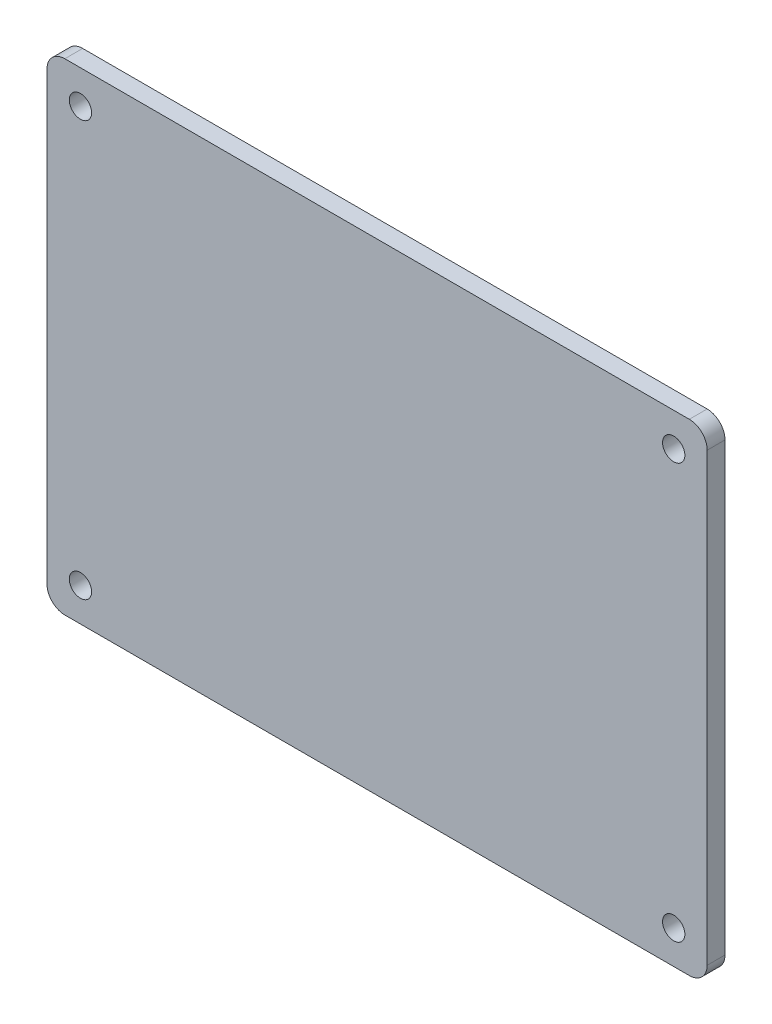
ISO-10303-21;
HEADER;
FILE_DESCRIPTION(('STEP AP214'),'2;1');
FILE_NAME('part.step','',(''),(''),'','','');
FILE_SCHEMA(('AUTOMOTIVE_DESIGN { 1 0 10303 214 1 1 1 1 }'));
ENDSEC;
DATA;
#1=APPLICATION_CONTEXT('core data for automotive mechanical design processes');
#2=APPLICATION_PROTOCOL_DEFINITION('international standard','automotive_design',2000,#1);
#3=PRODUCT_CONTEXT('',#1,'mechanical');
#4=PRODUCT('Part','Part','',(#3));
#5=PRODUCT_RELATED_PRODUCT_CATEGORY('part','',(#4));
#6=PRODUCT_DEFINITION_FORMATION('','',#4);
#7=PRODUCT_DEFINITION_CONTEXT('part definition',#1,'design');
#8=PRODUCT_DEFINITION('design','',#6,#7);
#9=PRODUCT_DEFINITION_SHAPE('','',#8);
#10=(LENGTH_UNIT() NAMED_UNIT(*) SI_UNIT(.MILLI.,.METRE.));
#11=(NAMED_UNIT(*) PLANE_ANGLE_UNIT() SI_UNIT($,.RADIAN.));
#12=(NAMED_UNIT(*) SI_UNIT($,.STERADIAN.) SOLID_ANGLE_UNIT());
#13=UNCERTAINTY_MEASURE_WITH_UNIT(LENGTH_MEASURE(1.E-05),#10,'distance_accuracy_value','');
#14=(GEOMETRIC_REPRESENTATION_CONTEXT(3) GLOBAL_UNCERTAINTY_ASSIGNED_CONTEXT((#13)) GLOBAL_UNIT_ASSIGNED_CONTEXT((#10,
#11,#12)) REPRESENTATION_CONTEXT('',''));
#15=CARTESIAN_POINT('',(0.,0.,0.));
#16=DIRECTION('',(0.,0.,1.));
#17=DIRECTION('',(1.,0.,0.));
#18=AXIS2_PLACEMENT_3D('',#15,#16,#17);
#19=CARTESIAN_POINT('',(-37.,-27.,2.));
#20=DIRECTION('',(1.,0.,0.));
#21=DIRECTION('',(0.,0.,-1.));
#22=AXIS2_PLACEMENT_3D('',#19,#20,#21);
#23=PLANE('',#22);
#24=DIRECTION('',(0.,-1.,0.));
#25=VECTOR('',#24,1.);
#26=CARTESIAN_POINT('',(-37.,-27.,2.));
#27=LINE('',#26,#25);
#28=CARTESIAN_POINT('',(-37.,25.,2.));
#29=VERTEX_POINT('',#28);
#30=CARTESIAN_POINT('',(-37.,-25.,2.));
#31=VERTEX_POINT('',#30);
#32=EDGE_CURVE('E144',#29,#31,#27,.T.);
#33=ORIENTED_EDGE('',*,*,#32,.F.);
#34=DIRECTION('',(0.,0.,-1.));
#35=VECTOR('',#34,1.);
#36=CARTESIAN_POINT('',(-37.,25.,2.));
#37=LINE('',#36,#35);
#38=CARTESIAN_POINT('',(-37.,25.,0.));
#39=VERTEX_POINT('',#38);
#40=EDGE_CURVE('E11',#29,#39,#37,.T.);
#41=ORIENTED_EDGE('',*,*,#40,.T.);
#42=DIRECTION('',(0.,-1.,0.));
#43=VECTOR('',#42,1.);
#44=CARTESIAN_POINT('',(-37.,-27.,0.));
#45=LINE('',#44,#43);
#46=CARTESIAN_POINT('',(-37.,-25.,0.));
#47=VERTEX_POINT('',#46);
#48=EDGE_CURVE('E146',#39,#47,#45,.T.);
#49=ORIENTED_EDGE('',*,*,#48,.T.);
#50=DIRECTION('',(0.,0.,-1.));
#51=VECTOR('',#50,1.);
#52=CARTESIAN_POINT('',(-37.,-25.,2.));
#53=LINE('',#52,#51);
#54=EDGE_CURVE('E52',#47,#31,#53,.F.);
#55=ORIENTED_EDGE('',*,*,#54,.T.);
#56=EDGE_LOOP('',(#33,#41,#49,#55));
#57=FACE_BOUND('',#56,.T.);
#58=ADVANCED_FACE('F43',(#57),#23,.F.);
#59=CARTESIAN_POINT('',(37.,-27.,2.));
#60=DIRECTION('',(0.,1.,0.));
#61=DIRECTION('',(-1.,0.,0.));
#62=AXIS2_PLACEMENT_3D('',#59,#60,#61);
#63=PLANE('',#62);
#64=DIRECTION('',(1.,0.,0.));
#65=VECTOR('',#64,1.);
#66=CARTESIAN_POINT('',(37.,-27.,0.));
#67=LINE('',#66,#65);
#68=CARTESIAN_POINT('',(-35.,-27.,0.));
#69=VERTEX_POINT('',#68);
#70=CARTESIAN_POINT('',(35.,-27.,0.));
#71=VERTEX_POINT('',#70);
#72=EDGE_CURVE('E140',#69,#71,#67,.T.);
#73=ORIENTED_EDGE('',*,*,#72,.T.);
#74=DIRECTION('',(0.,0.,-1.));
#75=VECTOR('',#74,1.);
#76=CARTESIAN_POINT('',(35.,-27.,2.));
#77=LINE('',#76,#75);
#78=CARTESIAN_POINT('',(35.,-27.,2.));
#79=VERTEX_POINT('',#78);
#80=EDGE_CURVE('E116',#71,#79,#77,.F.);
#81=ORIENTED_EDGE('',*,*,#80,.T.);
#82=DIRECTION('',(1.,0.,0.));
#83=VECTOR('',#82,1.);
#84=CARTESIAN_POINT('',(37.,-27.,2.));
#85=LINE('',#84,#83);
#86=CARTESIAN_POINT('',(-35.,-27.,2.));
#87=VERTEX_POINT('',#86);
#88=EDGE_CURVE('E196',#87,#79,#85,.T.);
#89=ORIENTED_EDGE('',*,*,#88,.F.);
#90=DIRECTION('',(0.,0.,-1.));
#91=VECTOR('',#90,1.);
#92=CARTESIAN_POINT('',(-35.,-27.,2.));
#93=LINE('',#92,#91);
#94=EDGE_CURVE('E122',#87,#69,#93,.T.);
#95=ORIENTED_EDGE('',*,*,#94,.T.);
#96=EDGE_LOOP('',(#73,#81,#89,#95));
#97=FACE_BOUND('',#96,.T.);
#98=ADVANCED_FACE('F200',(#97),#63,.F.);
#99=CARTESIAN_POINT('',(37.,-27.,2.));
#100=DIRECTION('',(-1.,0.,0.));
#101=DIRECTION('',(0.,0.,1.));
#102=AXIS2_PLACEMENT_3D('',#99,#100,#101);
#103=PLANE('',#102);
#104=DIRECTION('',(0.,1.,0.));
#105=VECTOR('',#104,1.);
#106=CARTESIAN_POINT('',(37.,-27.,2.));
#107=LINE('',#106,#105);
#108=CARTESIAN_POINT('',(37.,-25.,2.));
#109=VERTEX_POINT('',#108);
#110=CARTESIAN_POINT('',(37.,25.,2.));
#111=VERTEX_POINT('',#110);
#112=EDGE_CURVE('E131',#109,#111,#107,.T.);
#113=ORIENTED_EDGE('',*,*,#112,.F.);
#114=DIRECTION('',(0.,0.,-1.));
#115=VECTOR('',#114,1.);
#116=CARTESIAN_POINT('',(37.,-25.,2.));
#117=LINE('',#116,#115);
#118=CARTESIAN_POINT('',(37.,-25.,0.));
#119=VERTEX_POINT('',#118);
#120=EDGE_CURVE('E115',#109,#119,#117,.T.);
#121=ORIENTED_EDGE('',*,*,#120,.T.);
#122=DIRECTION('',(0.,1.,0.));
#123=VECTOR('',#122,1.);
#124=CARTESIAN_POINT('',(37.,-27.,0.));
#125=LINE('',#124,#123);
#126=CARTESIAN_POINT('',(37.,25.,0.));
#127=VERTEX_POINT('',#126);
#128=EDGE_CURVE('E129',#119,#127,#125,.T.);
#129=ORIENTED_EDGE('',*,*,#128,.T.);
#130=DIRECTION('',(0.,0.,-1.));
#131=VECTOR('',#130,1.);
#132=CARTESIAN_POINT('',(37.,25.,2.));
#133=LINE('',#132,#131);
#134=EDGE_CURVE('E134',#127,#111,#133,.F.);
#135=ORIENTED_EDGE('',*,*,#134,.T.);
#136=EDGE_LOOP('',(#113,#121,#129,#135));
#137=FACE_BOUND('',#136,.T.);
#138=ADVANCED_FACE('F128',(#137),#103,.F.);
#139=CARTESIAN_POINT('',(37.,27.,2.));
#140=DIRECTION('',(0.,-1.,0.));
#141=DIRECTION('',(1.,0.,0.));
#142=AXIS2_PLACEMENT_3D('',#139,#140,#141);
#143=PLANE('',#142);
#144=DIRECTION('',(-1.,0.,0.));
#145=VECTOR('',#144,1.);
#146=CARTESIAN_POINT('',(37.,27.,2.));
#147=LINE('',#146,#145);
#148=CARTESIAN_POINT('',(35.,27.,2.));
#149=VERTEX_POINT('',#148);
#150=CARTESIAN_POINT('',(-35.,27.,2.));
#151=VERTEX_POINT('',#150);
#152=EDGE_CURVE('E151',#149,#151,#147,.T.);
#153=ORIENTED_EDGE('',*,*,#152,.F.);
#154=DIRECTION('',(0.,0.,-1.));
#155=VECTOR('',#154,1.);
#156=CARTESIAN_POINT('',(35.,27.,2.));
#157=LINE('',#156,#155);
#158=CARTESIAN_POINT('',(35.,27.,0.));
#159=VERTEX_POINT('',#158);
#160=EDGE_CURVE('E178',#149,#159,#157,.T.);
#161=ORIENTED_EDGE('',*,*,#160,.T.);
#162=DIRECTION('',(-1.,0.,0.));
#163=VECTOR('',#162,1.);
#164=CARTESIAN_POINT('',(37.,27.,0.));
#165=LINE('',#164,#163);
#166=CARTESIAN_POINT('',(-35.,27.,0.));
#167=VERTEX_POINT('',#166);
#168=EDGE_CURVE('E139',#159,#167,#165,.T.);
#169=ORIENTED_EDGE('',*,*,#168,.T.);
#170=DIRECTION('',(0.,0.,-1.));
#171=VECTOR('',#170,1.);
#172=CARTESIAN_POINT('',(-35.,27.,2.));
#173=LINE('',#172,#171);
#174=EDGE_CURVE('E59',#167,#151,#173,.F.);
#175=ORIENTED_EDGE('',*,*,#174,.T.);
#176=EDGE_LOOP('',(#153,#161,#169,#175));
#177=FACE_BOUND('',#176,.T.);
#178=ADVANCED_FACE('F327',(#177),#143,.F.);
#179=CARTESIAN_POINT('',(0.,0.,2.));
#180=DIRECTION('',(0.,0.,1.));
#181=DIRECTION('',(1.,0.,0.));
#182=AXIS2_PLACEMENT_3D('',#179,#180,#181);
#183=PLANE('',#182);
#184=CARTESIAN_POINT('',(33.25,-23.25,2.));
#185=DIRECTION('',(0.,0.,1.));
#186=DIRECTION('',(1.,0.,0.));
#187=AXIS2_PLACEMENT_3D('',#184,#185,#186);
#188=CIRCLE('',#187,1.25);
#189=CARTESIAN_POINT('',(34.5,-23.25,2.));
#190=VERTEX_POINT('',#189);
#191=EDGE_CURVE('E222',#190,#190,#188,.F.);
#192=ORIENTED_EDGE('',*,*,#191,.T.);
#193=EDGE_LOOP('',(#192));
#194=FACE_BOUND('',#193,.T.);
#195=CARTESIAN_POINT('',(-33.25,-23.25,2.));
#196=DIRECTION('',(0.,0.,1.));
#197=DIRECTION('',(1.,0.,0.));
#198=AXIS2_PLACEMENT_3D('',#195,#196,#197);
#199=CIRCLE('',#198,1.25);
#200=CARTESIAN_POINT('',(-32.,-23.25,2.));
#201=VERTEX_POINT('',#200);
#202=EDGE_CURVE('E230',#201,#201,#199,.F.);
#203=ORIENTED_EDGE('',*,*,#202,.T.);
#204=EDGE_LOOP('',(#203));
#205=FACE_BOUND('',#204,.T.);
#206=CARTESIAN_POINT('',(-33.25,23.25,2.));
#207=DIRECTION('',(0.,0.,1.));
#208=DIRECTION('',(1.,0.,0.));
#209=AXIS2_PLACEMENT_3D('',#206,#207,#208);
#210=CIRCLE('',#209,1.25);
#211=CARTESIAN_POINT('',(-32.,23.25,2.));
#212=VERTEX_POINT('',#211);
#213=EDGE_CURVE('E216',#212,#212,#210,.F.);
#214=ORIENTED_EDGE('',*,*,#213,.T.);
#215=EDGE_LOOP('',(#214));
#216=FACE_BOUND('',#215,.T.);
#217=CARTESIAN_POINT('',(33.25,23.25,2.));
#218=DIRECTION('',(0.,0.,1.));
#219=DIRECTION('',(1.,0.,0.));
#220=AXIS2_PLACEMENT_3D('',#217,#218,#219);
#221=CIRCLE('',#220,1.25);
#222=CARTESIAN_POINT('',(34.5,23.25,2.));
#223=VERTEX_POINT('',#222);
#224=EDGE_CURVE('E205',#223,#223,#221,.F.);
#225=ORIENTED_EDGE('',*,*,#224,.T.);
#226=EDGE_LOOP('',(#225));
#227=FACE_BOUND('',#226,.T.);
#228=ORIENTED_EDGE('',*,*,#88,.T.);
#229=CARTESIAN_POINT('',(35.,-25.,2.));
#230=DIRECTION('',(0.,0.,1.));
#231=DIRECTION('',(1.,0.,0.));
#232=AXIS2_PLACEMENT_3D('',#229,#230,#231);
#233=CIRCLE('',#232,2.);
#234=EDGE_CURVE('E173',#79,#109,#233,.T.);
#235=ORIENTED_EDGE('',*,*,#234,.T.);
#236=ORIENTED_EDGE('',*,*,#112,.T.);
#237=CARTESIAN_POINT('',(35.,25.,2.));
#238=DIRECTION('',(0.,0.,1.));
#239=DIRECTION('',(1.,0.,0.));
#240=AXIS2_PLACEMENT_3D('',#237,#238,#239);
#241=CIRCLE('',#240,2.);
#242=EDGE_CURVE('E66',#111,#149,#241,.T.);
#243=ORIENTED_EDGE('',*,*,#242,.T.);
#244=ORIENTED_EDGE('',*,*,#152,.T.);
#245=CARTESIAN_POINT('',(-35.,25.,2.));
#246=DIRECTION('',(0.,0.,1.));
#247=DIRECTION('',(1.,0.,0.));
#248=AXIS2_PLACEMENT_3D('',#245,#246,#247);
#249=CIRCLE('',#248,2.);
#250=EDGE_CURVE('E168',#151,#29,#249,.T.);
#251=ORIENTED_EDGE('',*,*,#250,.T.);
#252=ORIENTED_EDGE('',*,*,#32,.T.);
#253=CARTESIAN_POINT('',(-35.,-25.,2.));
#254=DIRECTION('',(0.,0.,1.));
#255=DIRECTION('',(1.,0.,0.));
#256=AXIS2_PLACEMENT_3D('',#253,#254,#255);
#257=CIRCLE('',#256,2.);
#258=EDGE_CURVE('E165',#31,#87,#257,.T.);
#259=ORIENTED_EDGE('',*,*,#258,.T.);
#260=EDGE_LOOP('',(#228,#235,#236,#243,#244,#251,#252,#259));
#261=FACE_BOUND('',#260,.T.);
#262=ADVANCED_FACE('F192',(#194,#205,#216,#227,#261),#183,.T.);
#263=CARTESIAN_POINT('',(0.,0.,0.));
#264=DIRECTION('',(0.,0.,1.));
#265=DIRECTION('',(1.,0.,0.));
#266=AXIS2_PLACEMENT_3D('',#263,#264,#265);
#267=PLANE('',#266);
#268=CARTESIAN_POINT('',(33.25,-23.25,0.));
#269=DIRECTION('',(0.,0.,-1.));
#270=DIRECTION('',(-1.,0.,0.));
#271=AXIS2_PLACEMENT_3D('',#268,#269,#270);
#272=CIRCLE('',#271,1.25);
#273=CARTESIAN_POINT('',(32.,-23.25,0.));
#274=VERTEX_POINT('',#273);
#275=EDGE_CURVE('E218',#274,#274,#272,.T.);
#276=ORIENTED_EDGE('',*,*,#275,.F.);
#277=EDGE_LOOP('',(#276));
#278=FACE_BOUND('',#277,.T.);
#279=CARTESIAN_POINT('',(-33.25,-23.25,0.));
#280=DIRECTION('',(0.,0.,-1.));
#281=DIRECTION('',(-1.,0.,0.));
#282=AXIS2_PLACEMENT_3D('',#279,#280,#281);
#283=CIRCLE('',#282,1.25);
#284=CARTESIAN_POINT('',(-34.5,-23.25,0.));
#285=VERTEX_POINT('',#284);
#286=EDGE_CURVE('E226',#285,#285,#283,.T.);
#287=ORIENTED_EDGE('',*,*,#286,.F.);
#288=EDGE_LOOP('',(#287));
#289=FACE_BOUND('',#288,.T.);
#290=CARTESIAN_POINT('',(-33.25,23.25,0.));
#291=DIRECTION('',(0.,0.,-1.));
#292=DIRECTION('',(-1.,0.,0.));
#293=AXIS2_PLACEMENT_3D('',#290,#291,#292);
#294=CIRCLE('',#293,1.25);
#295=CARTESIAN_POINT('',(-34.5,23.25,0.));
#296=VERTEX_POINT('',#295);
#297=EDGE_CURVE('E234',#296,#296,#294,.T.);
#298=ORIENTED_EDGE('',*,*,#297,.F.);
#299=EDGE_LOOP('',(#298));
#300=FACE_BOUND('',#299,.T.);
#301=CARTESIAN_POINT('',(33.25,23.25,0.));
#302=DIRECTION('',(0.,0.,-1.));
#303=DIRECTION('',(-1.,0.,0.));
#304=AXIS2_PLACEMENT_3D('',#301,#302,#303);
#305=CIRCLE('',#304,1.25);
#306=CARTESIAN_POINT('',(32.,23.25,0.));
#307=VERTEX_POINT('',#306);
#308=EDGE_CURVE('E202',#307,#307,#305,.T.);
#309=ORIENTED_EDGE('',*,*,#308,.F.);
#310=EDGE_LOOP('',(#309));
#311=FACE_BOUND('',#310,.T.);
#312=ORIENTED_EDGE('',*,*,#128,.F.);
#313=CARTESIAN_POINT('',(35.,-25.,0.));
#314=DIRECTION('',(0.,0.,1.));
#315=DIRECTION('',(1.,0.,0.));
#316=AXIS2_PLACEMENT_3D('',#313,#314,#315);
#317=CIRCLE('',#316,2.);
#318=EDGE_CURVE('E111',#119,#71,#317,.F.);
#319=ORIENTED_EDGE('',*,*,#318,.T.);
#320=ORIENTED_EDGE('',*,*,#72,.F.);
#321=CARTESIAN_POINT('',(-35.,-25.,0.));
#322=DIRECTION('',(0.,0.,1.));
#323=DIRECTION('',(1.,0.,0.));
#324=AXIS2_PLACEMENT_3D('',#321,#322,#323);
#325=CIRCLE('',#324,2.);
#326=EDGE_CURVE('E133',#69,#47,#325,.F.);
#327=ORIENTED_EDGE('',*,*,#326,.T.);
#328=ORIENTED_EDGE('',*,*,#48,.F.);
#329=CARTESIAN_POINT('',(-35.,25.,0.));
#330=DIRECTION('',(0.,0.,1.));
#331=DIRECTION('',(1.,0.,0.));
#332=AXIS2_PLACEMENT_3D('',#329,#330,#331);
#333=CIRCLE('',#332,2.);
#334=EDGE_CURVE('E155',#39,#167,#333,.F.);
#335=ORIENTED_EDGE('',*,*,#334,.T.);
#336=ORIENTED_EDGE('',*,*,#168,.F.);
#337=CARTESIAN_POINT('',(35.,25.,0.));
#338=DIRECTION('',(0.,0.,1.));
#339=DIRECTION('',(1.,0.,0.));
#340=AXIS2_PLACEMENT_3D('',#337,#338,#339);
#341=CIRCLE('',#340,2.);
#342=EDGE_CURVE('E123',#159,#127,#341,.F.);
#343=ORIENTED_EDGE('',*,*,#342,.T.);
#344=EDGE_LOOP('',(#312,#319,#320,#327,#328,#335,#336,#343));
#345=FACE_BOUND('',#344,.T.);
#346=ADVANCED_FACE('F136',(#278,#289,#300,#311,#345),#267,.F.);
#347=CARTESIAN_POINT('',(33.25,23.25,2.001));
#348=DIRECTION('',(0.,0.,-1.));
#349=DIRECTION('',(-1.,0.,0.));
#350=AXIS2_PLACEMENT_3D('',#347,#348,#349);
#351=CYLINDRICAL_SURFACE('',#350,1.25);
#352=ORIENTED_EDGE('',*,*,#224,.F.);
#353=EDGE_LOOP('',(#352));
#354=FACE_BOUND('',#353,.T.);
#355=ORIENTED_EDGE('',*,*,#308,.T.);
#356=EDGE_LOOP('',(#355));
#357=FACE_BOUND('',#356,.T.);
#358=ADVANCED_FACE('F248',(#354,#357),#351,.F.);
#359=CARTESIAN_POINT('',(-33.25,23.25,2.001));
#360=DIRECTION('',(0.,0.,-1.));
#361=DIRECTION('',(-1.,0.,0.));
#362=AXIS2_PLACEMENT_3D('',#359,#360,#361);
#363=CYLINDRICAL_SURFACE('',#362,1.25);
#364=ORIENTED_EDGE('',*,*,#213,.F.);
#365=EDGE_LOOP('',(#364));
#366=FACE_BOUND('',#365,.T.);
#367=ORIENTED_EDGE('',*,*,#297,.T.);
#368=EDGE_LOOP('',(#367));
#369=FACE_BOUND('',#368,.T.);
#370=ADVANCED_FACE('F244',(#366,#369),#363,.F.);
#371=CARTESIAN_POINT('',(-33.25,-23.25,2.001));
#372=DIRECTION('',(0.,0.,-1.));
#373=DIRECTION('',(-1.,0.,0.));
#374=AXIS2_PLACEMENT_3D('',#371,#372,#373);
#375=CYLINDRICAL_SURFACE('',#374,1.25);
#376=ORIENTED_EDGE('',*,*,#202,.F.);
#377=EDGE_LOOP('',(#376));
#378=FACE_BOUND('',#377,.T.);
#379=ORIENTED_EDGE('',*,*,#286,.T.);
#380=EDGE_LOOP('',(#379));
#381=FACE_BOUND('',#380,.T.);
#382=ADVANCED_FACE('F247',(#378,#381),#375,.F.);
#383=CARTESIAN_POINT('',(33.25,-23.25,2.001));
#384=DIRECTION('',(0.,0.,-1.));
#385=DIRECTION('',(-1.,0.,0.));
#386=AXIS2_PLACEMENT_3D('',#383,#384,#385);
#387=CYLINDRICAL_SURFACE('',#386,1.25);
#388=ORIENTED_EDGE('',*,*,#191,.F.);
#389=EDGE_LOOP('',(#388));
#390=FACE_BOUND('',#389,.T.);
#391=ORIENTED_EDGE('',*,*,#275,.T.);
#392=EDGE_LOOP('',(#391));
#393=FACE_BOUND('',#392,.T.);
#394=ADVANCED_FACE('F277',(#390,#393),#387,.F.);
#395=CARTESIAN_POINT('',(35.,-25.,2.));
#396=DIRECTION('',(0.,0.,-1.));
#397=DIRECTION('',(-1.,0.,0.));
#398=AXIS2_PLACEMENT_3D('',#395,#396,#397);
#399=CYLINDRICAL_SURFACE('',#398,2.);
#400=ORIENTED_EDGE('',*,*,#234,.F.);
#401=ORIENTED_EDGE('',*,*,#80,.F.);
#402=ORIENTED_EDGE('',*,*,#318,.F.);
#403=ORIENTED_EDGE('',*,*,#120,.F.);
#404=EDGE_LOOP('',(#400,#401,#402,#403));
#405=FACE_BOUND('',#404,.T.);
#406=ADVANCED_FACE('F114',(#405),#399,.T.);
#407=CARTESIAN_POINT('',(35.,25.,2.));
#408=DIRECTION('',(0.,0.,-1.));
#409=DIRECTION('',(-1.,0.,0.));
#410=AXIS2_PLACEMENT_3D('',#407,#408,#409);
#411=CYLINDRICAL_SURFACE('',#410,2.);
#412=ORIENTED_EDGE('',*,*,#242,.F.);
#413=ORIENTED_EDGE('',*,*,#134,.F.);
#414=ORIENTED_EDGE('',*,*,#342,.F.);
#415=ORIENTED_EDGE('',*,*,#160,.F.);
#416=EDGE_LOOP('',(#412,#413,#414,#415));
#417=FACE_BOUND('',#416,.T.);
#418=ADVANCED_FACE('F276',(#417),#411,.T.);
#419=CARTESIAN_POINT('',(-35.,25.,2.));
#420=DIRECTION('',(0.,0.,-1.));
#421=DIRECTION('',(-1.,0.,0.));
#422=AXIS2_PLACEMENT_3D('',#419,#420,#421);
#423=CYLINDRICAL_SURFACE('',#422,2.);
#424=ORIENTED_EDGE('',*,*,#250,.F.);
#425=ORIENTED_EDGE('',*,*,#174,.F.);
#426=ORIENTED_EDGE('',*,*,#334,.F.);
#427=ORIENTED_EDGE('',*,*,#40,.F.);
#428=EDGE_LOOP('',(#424,#425,#426,#427));
#429=FACE_BOUND('',#428,.T.);
#430=ADVANCED_FACE('F279',(#429),#423,.T.);
#431=CARTESIAN_POINT('',(-35.,-25.,2.));
#432=DIRECTION('',(0.,0.,-1.));
#433=DIRECTION('',(-1.,0.,0.));
#434=AXIS2_PLACEMENT_3D('',#431,#432,#433);
#435=CYLINDRICAL_SURFACE('',#434,2.);
#436=ORIENTED_EDGE('',*,*,#258,.F.);
#437=ORIENTED_EDGE('',*,*,#54,.F.);
#438=ORIENTED_EDGE('',*,*,#326,.F.);
#439=ORIENTED_EDGE('',*,*,#94,.F.);
#440=EDGE_LOOP('',(#436,#437,#438,#439));
#441=FACE_BOUND('',#440,.T.);
#442=ADVANCED_FACE('F45',(#441),#435,.T.);
#443=CLOSED_SHELL('',(#58,#98,#138,#178,#262,#346,#358,#370,#382,#394,#406,#418,#430,#442));
#444=MANIFOLD_SOLID_BREP('B2',#443);
#445=ADVANCED_BREP_SHAPE_REPRESENTATION('',(#18,#444),#14);
#446=SHAPE_DEFINITION_REPRESENTATION(#9,#445);
ENDSEC;
END-ISO-10303-21;
